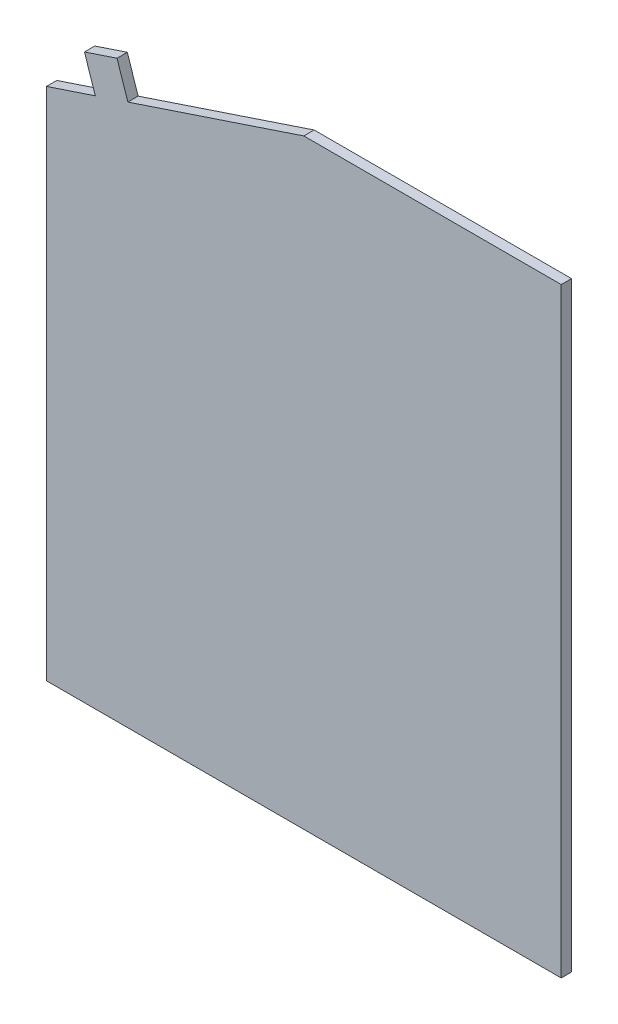
ISO-10303-21;
HEADER;
FILE_DESCRIPTION(('STEP AP214'),'2;1');
FILE_NAME('part.step','',(''),(''),'','','');
FILE_SCHEMA(('AUTOMOTIVE_DESIGN { 1 0 10303 214 1 1 1 1 }'));
ENDSEC;
DATA;
#1=APPLICATION_CONTEXT('core data for automotive mechanical design processes');
#2=APPLICATION_PROTOCOL_DEFINITION('international standard','automotive_design',2000,#1);
#3=PRODUCT_CONTEXT('',#1,'mechanical');
#4=PRODUCT('Part','Part','',(#3));
#5=PRODUCT_RELATED_PRODUCT_CATEGORY('part','',(#4));
#6=PRODUCT_DEFINITION_FORMATION('','',#4);
#7=PRODUCT_DEFINITION_CONTEXT('part definition',#1,'design');
#8=PRODUCT_DEFINITION('design','',#6,#7);
#9=PRODUCT_DEFINITION_SHAPE('','',#8);
#10=(LENGTH_UNIT() NAMED_UNIT(*) SI_UNIT(.MILLI.,.METRE.));
#11=(NAMED_UNIT(*) PLANE_ANGLE_UNIT() SI_UNIT($,.RADIAN.));
#12=(NAMED_UNIT(*) SI_UNIT($,.STERADIAN.) SOLID_ANGLE_UNIT());
#13=UNCERTAINTY_MEASURE_WITH_UNIT(LENGTH_MEASURE(1.E-05),#10,'distance_accuracy_value','');
#14=(GEOMETRIC_REPRESENTATION_CONTEXT(3) GLOBAL_UNCERTAINTY_ASSIGNED_CONTEXT((#13)) GLOBAL_UNIT_ASSIGNED_CONTEXT((#10,
#11,#12)) REPRESENTATION_CONTEXT('',''));
#15=CARTESIAN_POINT('',(0.,0.,0.));
#16=DIRECTION('',(0.,0.,1.));
#17=DIRECTION('',(1.,0.,0.));
#18=AXIS2_PLACEMENT_3D('',#15,#16,#17);
#19=CARTESIAN_POINT('',(0.,0.,3.));
#20=DIRECTION('',(1.,0.,0.));
#21=DIRECTION('',(0.,0.,-1.));
#22=AXIS2_PLACEMENT_3D('',#19,#20,#21);
#23=PLANE('',#22);
#24=DIRECTION('',(0.,-1.,0.));
#25=VECTOR('',#24,1.);
#26=CARTESIAN_POINT('',(0.,0.,0.));
#27=LINE('',#26,#25);
#28=CARTESIAN_POINT('',(0.,150.,0.));
#29=VERTEX_POINT('',#28);
#30=CARTESIAN_POINT('',(0.,0.,0.));
#31=VERTEX_POINT('',#30);
#32=EDGE_CURVE('E139',#29,#31,#27,.T.);
#33=ORIENTED_EDGE('',*,*,#32,.T.);
#34=DIRECTION('',(0.,0.,-1.));
#35=VECTOR('',#34,1.);
#36=CARTESIAN_POINT('',(0.,0.,3.));
#37=LINE('',#36,#35);
#38=CARTESIAN_POINT('',(0.,0.,3.));
#39=VERTEX_POINT('',#38);
#40=EDGE_CURVE('E11',#39,#31,#37,.T.);
#41=ORIENTED_EDGE('',*,*,#40,.F.);
#42=DIRECTION('',(0.,-1.,0.));
#43=VECTOR('',#42,1.);
#44=CARTESIAN_POINT('',(0.,0.,3.));
#45=LINE('',#44,#43);
#46=CARTESIAN_POINT('',(0.,150.,3.));
#47=VERTEX_POINT('',#46);
#48=EDGE_CURVE('E155',#47,#39,#45,.T.);
#49=ORIENTED_EDGE('',*,*,#48,.F.);
#50=DIRECTION('',(0.,0.,-1.));
#51=VECTOR('',#50,1.);
#52=CARTESIAN_POINT('',(0.,150.,3.));
#53=LINE('',#52,#51);
#54=EDGE_CURVE('E135',#47,#29,#53,.T.);
#55=ORIENTED_EDGE('',*,*,#54,.T.);
#56=EDGE_LOOP('',(#33,#41,#49,#55));
#57=FACE_BOUND('',#56,.T.);
#58=ADVANCED_FACE('F37',(#57),#23,.F.);
#59=CARTESIAN_POINT('',(0.,0.,3.));
#60=DIRECTION('',(0.,1.,0.));
#61=DIRECTION('',(0.,0.,1.));
#62=AXIS2_PLACEMENT_3D('',#59,#60,#61);
#63=PLANE('',#62);
#64=DIRECTION('',(1.,0.,0.));
#65=VECTOR('',#64,1.);
#66=CARTESIAN_POINT('',(0.,0.,0.));
#67=LINE('',#66,#65);
#68=CARTESIAN_POINT('',(150.,0.,0.));
#69=VERTEX_POINT('',#68);
#70=EDGE_CURVE('E142',#31,#69,#67,.T.);
#71=ORIENTED_EDGE('',*,*,#70,.T.);
#72=DIRECTION('',(0.,0.,-1.));
#73=VECTOR('',#72,1.);
#74=CARTESIAN_POINT('',(150.,0.,3.));
#75=LINE('',#74,#73);
#76=CARTESIAN_POINT('',(150.,0.,3.));
#77=VERTEX_POINT('',#76);
#78=EDGE_CURVE('E45',#77,#69,#75,.T.);
#79=ORIENTED_EDGE('',*,*,#78,.F.);
#80=DIRECTION('',(1.,0.,0.));
#81=VECTOR('',#80,1.);
#82=CARTESIAN_POINT('',(0.,0.,3.));
#83=LINE('',#82,#81);
#84=EDGE_CURVE('E99',#39,#77,#83,.T.);
#85=ORIENTED_EDGE('',*,*,#84,.F.);
#86=ORIENTED_EDGE('',*,*,#40,.T.);
#87=EDGE_LOOP('',(#71,#79,#85,#86));
#88=FACE_BOUND('',#87,.T.);
#89=ADVANCED_FACE('F198',(#88),#63,.F.);
#90=CARTESIAN_POINT('',(150.,175.,3.));
#91=DIRECTION('',(-1.,0.,0.));
#92=DIRECTION('',(0.,-1.,0.));
#93=AXIS2_PLACEMENT_3D('',#90,#91,#92);
#94=PLANE('',#93);
#95=DIRECTION('',(0.,1.,0.));
#96=VECTOR('',#95,1.);
#97=CARTESIAN_POINT('',(150.,175.,0.));
#98=LINE('',#97,#96);
#99=CARTESIAN_POINT('',(150.,175.,0.));
#100=VERTEX_POINT('',#99);
#101=EDGE_CURVE('E144',#69,#100,#98,.T.);
#102=ORIENTED_EDGE('',*,*,#101,.T.);
#103=DIRECTION('',(0.,0.,-1.));
#104=VECTOR('',#103,1.);
#105=CARTESIAN_POINT('',(150.,175.,3.));
#106=LINE('',#105,#104);
#107=CARTESIAN_POINT('',(150.,175.,3.));
#108=VERTEX_POINT('',#107);
#109=EDGE_CURVE('E165',#108,#100,#106,.T.);
#110=ORIENTED_EDGE('',*,*,#109,.F.);
#111=DIRECTION('',(0.,1.,0.));
#112=VECTOR('',#111,1.);
#113=CARTESIAN_POINT('',(150.,175.,3.));
#114=LINE('',#113,#112);
#115=EDGE_CURVE('E173',#77,#108,#114,.T.);
#116=ORIENTED_EDGE('',*,*,#115,.F.);
#117=ORIENTED_EDGE('',*,*,#78,.T.);
#118=EDGE_LOOP('',(#102,#110,#116,#117));
#119=FACE_BOUND('',#118,.T.);
#120=ADVANCED_FACE('F171',(#119),#94,.F.);
#121=CARTESIAN_POINT('',(75.,175.,3.));
#122=DIRECTION('',(0.,-1.,0.));
#123=DIRECTION('',(0.,0.,-1.));
#124=AXIS2_PLACEMENT_3D('',#121,#122,#123);
#125=PLANE('',#124);
#126=DIRECTION('',(-1.,0.,0.));
#127=VECTOR('',#126,1.);
#128=CARTESIAN_POINT('',(75.,175.,0.));
#129=LINE('',#128,#127);
#130=CARTESIAN_POINT('',(75.,175.,0.));
#131=VERTEX_POINT('',#130);
#132=EDGE_CURVE('E146',#100,#131,#129,.T.);
#133=ORIENTED_EDGE('',*,*,#132,.T.);
#134=DIRECTION('',(0.,0.,-1.));
#135=VECTOR('',#134,1.);
#136=CARTESIAN_POINT('',(75.,175.,3.));
#137=LINE('',#136,#135);
#138=CARTESIAN_POINT('',(75.,175.,3.));
#139=VERTEX_POINT('',#138);
#140=EDGE_CURVE('E162',#139,#131,#137,.T.);
#141=ORIENTED_EDGE('',*,*,#140,.F.);
#142=DIRECTION('',(-1.,0.,0.));
#143=VECTOR('',#142,1.);
#144=CARTESIAN_POINT('',(75.,175.,3.));
#145=LINE('',#144,#143);
#146=EDGE_CURVE('E189',#108,#139,#145,.T.);
#147=ORIENTED_EDGE('',*,*,#146,.F.);
#148=ORIENTED_EDGE('',*,*,#109,.T.);
#149=EDGE_LOOP('',(#133,#141,#147,#148));
#150=FACE_BOUND('',#149,.T.);
#151=ADVANCED_FACE('F182',(#150),#125,.F.);
#152=CARTESIAN_POINT('',(23.7170824512628,157.905694150421,3.));
#153=DIRECTION('',(0.316227766016837,-0.948683298050514,0.));
#154=DIRECTION('',(0.948683298050514,0.316227766016838,0.));
#155=AXIS2_PLACEMENT_3D('',#152,#153,#154);
#156=PLANE('',#155);
#157=DIRECTION('',(-0.948683298050514,-0.316227766016838,0.));
#158=VECTOR('',#157,1.);
#159=CARTESIAN_POINT('',(23.7170824512628,157.905694150421,0.));
#160=LINE('',#159,#158);
#161=CARTESIAN_POINT('',(23.7170824512628,157.905694150421,0.));
#162=VERTEX_POINT('',#161);
#163=EDGE_CURVE('E148',#131,#162,#160,.T.);
#164=ORIENTED_EDGE('',*,*,#163,.T.);
#165=DIRECTION('',(0.,0.,-1.));
#166=VECTOR('',#165,1.);
#167=CARTESIAN_POINT('',(23.7170824512628,157.905694150421,3.));
#168=LINE('',#167,#166);
#169=CARTESIAN_POINT('',(23.7170824512628,157.905694150421,3.));
#170=VERTEX_POINT('',#169);
#171=EDGE_CURVE('E159',#170,#162,#168,.T.);
#172=ORIENTED_EDGE('',*,*,#171,.F.);
#173=DIRECTION('',(-0.948683298050514,-0.316227766016838,0.));
#174=VECTOR('',#173,1.);
#175=CARTESIAN_POINT('',(23.7170824512628,157.905694150421,3.));
#176=LINE('',#175,#174);
#177=EDGE_CURVE('E188',#139,#170,#176,.T.);
#178=ORIENTED_EDGE('',*,*,#177,.F.);
#179=ORIENTED_EDGE('',*,*,#140,.T.);
#180=EDGE_LOOP('',(#164,#172,#178,#179));
#181=FACE_BOUND('',#180,.T.);
#182=ADVANCED_FACE('F186',(#181),#156,.F.);
#183=CARTESIAN_POINT('',(23.7170824512628,157.905694150421,3.));
#184=DIRECTION('',(-0.948683298050514,-0.316227766016838,0.));
#185=DIRECTION('',(0.316227766016838,-0.948683298050514,0.));
#186=AXIS2_PLACEMENT_3D('',#183,#184,#185);
#187=PLANE('',#186);
#188=DIRECTION('',(-0.316227766016838,0.948683298050514,0.));
#189=VECTOR('',#188,1.);
#190=CARTESIAN_POINT('',(23.7170824512628,157.905694150421,0.));
#191=LINE('',#190,#189);
#192=CARTESIAN_POINT('',(20.5548047910945,167.392527130926,0.));
#193=VERTEX_POINT('',#192);
#194=EDGE_CURVE('E150',#162,#193,#191,.T.);
#195=ORIENTED_EDGE('',*,*,#194,.T.);
#196=DIRECTION('',(0.,0.,-1.));
#197=VECTOR('',#196,1.);
#198=CARTESIAN_POINT('',(20.5548047910945,167.392527130926,3.));
#199=LINE('',#198,#197);
#200=CARTESIAN_POINT('',(20.5548047910945,167.392527130926,3.));
#201=VERTEX_POINT('',#200);
#202=EDGE_CURVE('E130',#201,#193,#199,.T.);
#203=ORIENTED_EDGE('',*,*,#202,.F.);
#204=DIRECTION('',(-0.316227766016838,0.948683298050514,0.));
#205=VECTOR('',#204,1.);
#206=CARTESIAN_POINT('',(23.7170824512628,157.905694150421,3.));
#207=LINE('',#206,#205);
#208=EDGE_CURVE('E121',#170,#201,#207,.T.);
#209=ORIENTED_EDGE('',*,*,#208,.F.);
#210=ORIENTED_EDGE('',*,*,#171,.T.);
#211=EDGE_LOOP('',(#195,#203,#209,#210));
#212=FACE_BOUND('',#211,.T.);
#213=ADVANCED_FACE('F210',(#212),#187,.F.);
#214=CARTESIAN_POINT('',(20.5548047910945,167.392527130926,3.));
#215=DIRECTION('',(0.316227766016838,-0.948683298050514,0.));
#216=DIRECTION('',(0.948683298050514,0.316227766016838,0.));
#217=AXIS2_PLACEMENT_3D('',#214,#215,#216);
#218=PLANE('',#217);
#219=DIRECTION('',(-0.948683298050514,-0.316227766016838,0.));
#220=VECTOR('',#219,1.);
#221=CARTESIAN_POINT('',(20.5548047910945,167.392527130926,0.));
#222=LINE('',#221,#220);
#223=CARTESIAN_POINT('',(11.0679718105893,164.230249470758,0.));
#224=VERTEX_POINT('',#223);
#225=EDGE_CURVE('E129',#193,#224,#222,.T.);
#226=ORIENTED_EDGE('',*,*,#225,.T.);
#227=DIRECTION('',(0.,0.,-1.));
#228=VECTOR('',#227,1.);
#229=CARTESIAN_POINT('',(11.0679718105893,164.230249470758,3.));
#230=LINE('',#229,#228);
#231=CARTESIAN_POINT('',(11.0679718105893,164.230249470758,3.));
#232=VERTEX_POINT('',#231);
#233=EDGE_CURVE('E126',#232,#224,#230,.T.);
#234=ORIENTED_EDGE('',*,*,#233,.F.);
#235=DIRECTION('',(-0.948683298050514,-0.316227766016838,0.));
#236=VECTOR('',#235,1.);
#237=CARTESIAN_POINT('',(20.5548047910945,167.392527130926,3.));
#238=LINE('',#237,#236);
#239=EDGE_CURVE('E115',#201,#232,#238,.T.);
#240=ORIENTED_EDGE('',*,*,#239,.F.);
#241=ORIENTED_EDGE('',*,*,#202,.T.);
#242=EDGE_LOOP('',(#226,#234,#240,#241));
#243=FACE_BOUND('',#242,.T.);
#244=ADVANCED_FACE('F127',(#243),#218,.F.);
#245=CARTESIAN_POINT('',(14.2302494707577,154.743416490253,3.));
#246=DIRECTION('',(0.948683298050514,0.316227766016837,0.));
#247=DIRECTION('',(-0.316227766016837,0.948683298050514,0.));
#248=AXIS2_PLACEMENT_3D('',#245,#246,#247);
#249=PLANE('',#248);
#250=DIRECTION('',(0.316227766016837,-0.948683298050514,0.));
#251=VECTOR('',#250,1.);
#252=CARTESIAN_POINT('',(14.2302494707577,154.743416490253,0.));
#253=LINE('',#252,#251);
#254=CARTESIAN_POINT('',(14.2302494707577,154.743416490253,0.));
#255=VERTEX_POINT('',#254);
#256=EDGE_CURVE('E85',#224,#255,#253,.T.);
#257=ORIENTED_EDGE('',*,*,#256,.T.);
#258=DIRECTION('',(0.,0.,-1.));
#259=VECTOR('',#258,1.);
#260=CARTESIAN_POINT('',(14.2302494707577,154.743416490253,3.));
#261=LINE('',#260,#259);
#262=CARTESIAN_POINT('',(14.2302494707577,154.743416490253,3.));
#263=VERTEX_POINT('',#262);
#264=EDGE_CURVE('E131',#263,#255,#261,.T.);
#265=ORIENTED_EDGE('',*,*,#264,.F.);
#266=DIRECTION('',(0.316227766016837,-0.948683298050514,0.));
#267=VECTOR('',#266,1.);
#268=CARTESIAN_POINT('',(14.2302494707577,154.743416490253,3.));
#269=LINE('',#268,#267);
#270=EDGE_CURVE('E119',#232,#263,#269,.T.);
#271=ORIENTED_EDGE('',*,*,#270,.F.);
#272=ORIENTED_EDGE('',*,*,#233,.T.);
#273=EDGE_LOOP('',(#257,#265,#271,#272));
#274=FACE_BOUND('',#273,.T.);
#275=ADVANCED_FACE('F133',(#274),#249,.F.);
#276=CARTESIAN_POINT('',(0.,150.,3.));
#277=DIRECTION('',(0.316227766016837,-0.948683298050514,0.));
#278=DIRECTION('',(0.948683298050514,0.316227766016838,0.));
#279=AXIS2_PLACEMENT_3D('',#276,#277,#278);
#280=PLANE('',#279);
#281=DIRECTION('',(-0.948683298050514,-0.316227766016837,0.));
#282=VECTOR('',#281,1.);
#283=CARTESIAN_POINT('',(0.,150.,0.));
#284=LINE('',#283,#282);
#285=EDGE_CURVE('E91',#255,#29,#284,.T.);
#286=ORIENTED_EDGE('',*,*,#285,.T.);
#287=ORIENTED_EDGE('',*,*,#54,.F.);
#288=DIRECTION('',(-0.948683298050514,-0.316227766016837,0.));
#289=VECTOR('',#288,1.);
#290=CARTESIAN_POINT('',(0.,150.,3.));
#291=LINE('',#290,#289);
#292=EDGE_CURVE('E53',#263,#47,#291,.T.);
#293=ORIENTED_EDGE('',*,*,#292,.F.);
#294=ORIENTED_EDGE('',*,*,#264,.T.);
#295=EDGE_LOOP('',(#286,#287,#293,#294));
#296=FACE_BOUND('',#295,.T.);
#297=ADVANCED_FACE('F218',(#296),#280,.F.);
#298=CARTESIAN_POINT('',(0.,0.,3.));
#299=DIRECTION('',(0.,0.,-1.));
#300=DIRECTION('',(-1.,0.,0.));
#301=AXIS2_PLACEMENT_3D('',#298,#299,#300);
#302=PLANE('',#301);
#303=ORIENTED_EDGE('',*,*,#48,.T.);
#304=ORIENTED_EDGE('',*,*,#84,.T.);
#305=ORIENTED_EDGE('',*,*,#115,.T.);
#306=ORIENTED_EDGE('',*,*,#146,.T.);
#307=ORIENTED_EDGE('',*,*,#177,.T.);
#308=ORIENTED_EDGE('',*,*,#208,.T.);
#309=ORIENTED_EDGE('',*,*,#239,.T.);
#310=ORIENTED_EDGE('',*,*,#270,.T.);
#311=ORIENTED_EDGE('',*,*,#292,.T.);
#312=EDGE_LOOP('',(#303,#304,#305,#306,#307,#308,#309,#310,#311));
#313=FACE_BOUND('',#312,.T.);
#314=ADVANCED_FACE('F117',(#313),#302,.F.);
#315=CARTESIAN_POINT('',(0.,0.,0.));
#316=DIRECTION('',(0.,0.,-1.));
#317=DIRECTION('',(-1.,0.,0.));
#318=AXIS2_PLACEMENT_3D('',#315,#316,#317);
#319=PLANE('',#318);
#320=ORIENTED_EDGE('',*,*,#32,.F.);
#321=ORIENTED_EDGE('',*,*,#285,.F.);
#322=ORIENTED_EDGE('',*,*,#256,.F.);
#323=ORIENTED_EDGE('',*,*,#225,.F.);
#324=ORIENTED_EDGE('',*,*,#194,.F.);
#325=ORIENTED_EDGE('',*,*,#163,.F.);
#326=ORIENTED_EDGE('',*,*,#132,.F.);
#327=ORIENTED_EDGE('',*,*,#101,.F.);
#328=ORIENTED_EDGE('',*,*,#70,.F.);
#329=EDGE_LOOP('',(#320,#321,#322,#323,#324,#325,#326,#327,#328));
#330=FACE_BOUND('',#329,.T.);
#331=ADVANCED_FACE('F177',(#330),#319,.T.);
#332=CLOSED_SHELL('',(#58,#89,#120,#151,#182,#213,#244,#275,#297,#314,#331));
#333=MANIFOLD_SOLID_BREP('B2',#332);
#334=ADVANCED_BREP_SHAPE_REPRESENTATION('',(#18,#333),#14);
#335=SHAPE_DEFINITION_REPRESENTATION(#9,#334);
ENDSEC;
END-ISO-10303-21;
